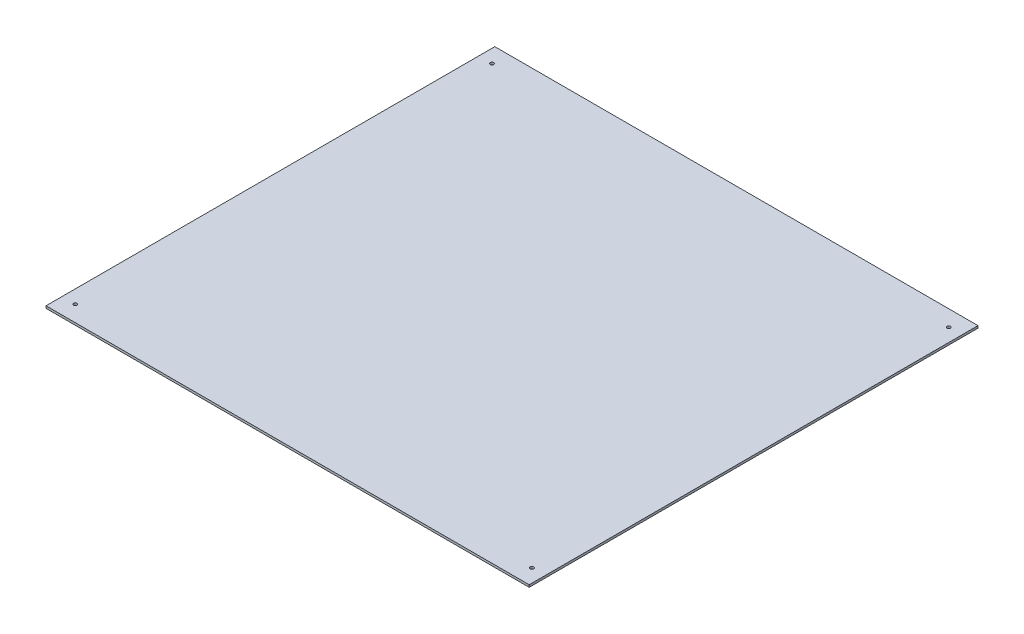
ISO-10303-21;
HEADER;
FILE_DESCRIPTION(('STEP AP214'),'2;1');
FILE_NAME('part.step','',(''),(''),'','','');
FILE_SCHEMA(('AUTOMOTIVE_DESIGN { 1 0 10303 214 1 1 1 1 }'));
ENDSEC;
DATA;
#1=APPLICATION_CONTEXT('core data for automotive mechanical design processes');
#2=APPLICATION_PROTOCOL_DEFINITION('international standard','automotive_design',2000,#1);
#3=PRODUCT_CONTEXT('',#1,'mechanical');
#4=PRODUCT('Part','Part','',(#3));
#5=PRODUCT_RELATED_PRODUCT_CATEGORY('part','',(#4));
#6=PRODUCT_DEFINITION_FORMATION('','',#4);
#7=PRODUCT_DEFINITION_CONTEXT('part definition',#1,'design');
#8=PRODUCT_DEFINITION('design','',#6,#7);
#9=PRODUCT_DEFINITION_SHAPE('','',#8);
#10=(LENGTH_UNIT() NAMED_UNIT(*) SI_UNIT(.MILLI.,.METRE.));
#11=(NAMED_UNIT(*) PLANE_ANGLE_UNIT() SI_UNIT($,.RADIAN.));
#12=(NAMED_UNIT(*) SI_UNIT($,.STERADIAN.) SOLID_ANGLE_UNIT());
#13=UNCERTAINTY_MEASURE_WITH_UNIT(LENGTH_MEASURE(1.E-05),#10,'distance_accuracy_value','');
#14=(GEOMETRIC_REPRESENTATION_CONTEXT(3) GLOBAL_UNCERTAINTY_ASSIGNED_CONTEXT((#13)) GLOBAL_UNIT_ASSIGNED_CONTEXT((#10,
#11,#12)) REPRESENTATION_CONTEXT('',''));
#15=CARTESIAN_POINT('',(0.,0.,0.));
#16=DIRECTION('',(0.,0.,1.));
#17=DIRECTION('',(1.,0.,0.));
#18=AXIS2_PLACEMENT_3D('',#15,#16,#17);
#19=CARTESIAN_POINT('',(0.,2.,0.));
#20=DIRECTION('',(0.,-1.,0.));
#21=DIRECTION('',(0.,0.,-1.));
#22=AXIS2_PLACEMENT_3D('',#19,#20,#21);
#23=PLANE('',#22);
#24=CARTESIAN_POINT('',(12.5,2.,-385.));
#25=DIRECTION('',(0.,1.,0.));
#26=DIRECTION('',(0.,0.,1.));
#27=AXIS2_PLACEMENT_3D('',#24,#25,#26);
#28=CIRCLE('',#27,1.55000000000003);
#29=CARTESIAN_POINT('',(12.5,2.,-383.45));
#30=VERTEX_POINT('',#29);
#31=EDGE_CURVE('E43',#30,#30,#28,.T.);
#32=ORIENTED_EDGE('',*,*,#31,.F.);
#33=EDGE_LOOP('',(#32));
#34=FACE_BOUND('',#33,.T.);
#35=CARTESIAN_POINT('',(418.,2.,-385.));
#36=DIRECTION('',(0.,1.,0.));
#37=DIRECTION('',(0.,0.,-1.));
#38=AXIS2_PLACEMENT_3D('',#35,#36,#37);
#39=CIRCLE('',#38,1.55);
#40=CARTESIAN_POINT('',(418.,2.,-386.55));
#41=VERTEX_POINT('',#40);
#42=EDGE_CURVE('E109',#41,#41,#39,.T.);
#43=ORIENTED_EDGE('',*,*,#42,.F.);
#44=EDGE_LOOP('',(#43));
#45=FACE_BOUND('',#44,.T.);
#46=CARTESIAN_POINT('',(418.,2.,-15.));
#47=DIRECTION('',(0.,1.,0.));
#48=DIRECTION('',(0.,0.,1.));
#49=AXIS2_PLACEMENT_3D('',#46,#47,#48);
#50=CIRCLE('',#49,1.54999999999999);
#51=CARTESIAN_POINT('',(418.,2.,-13.45));
#52=VERTEX_POINT('',#51);
#53=EDGE_CURVE('E116',#52,#52,#50,.T.);
#54=ORIENTED_EDGE('',*,*,#53,.F.);
#55=EDGE_LOOP('',(#54));
#56=FACE_BOUND('',#55,.T.);
#57=CARTESIAN_POINT('',(12.5,2.,-15.));
#58=DIRECTION('',(0.,1.,0.));
#59=DIRECTION('',(0.,0.,-1.));
#60=AXIS2_PLACEMENT_3D('',#57,#58,#59);
#61=CIRCLE('',#60,1.55000000000002);
#62=CARTESIAN_POINT('',(12.5,2.,-16.55));
#63=VERTEX_POINT('',#62);
#64=EDGE_CURVE('E101',#63,#63,#61,.T.);
#65=ORIENTED_EDGE('',*,*,#64,.F.);
#66=EDGE_LOOP('',(#65));
#67=FACE_BOUND('',#66,.T.);
#68=DIRECTION('',(0.,0.,-1.));
#69=VECTOR('',#68,1.);
#70=CARTESIAN_POINT('',(429.75,2.,-0.750000000000026));
#71=LINE('',#70,#69);
#72=CARTESIAN_POINT('',(429.75,2.,-0.750000000000026));
#73=VERTEX_POINT('',#72);
#74=CARTESIAN_POINT('',(429.75,2.,-399.25));
#75=VERTEX_POINT('',#74);
#76=EDGE_CURVE('E78',#73,#75,#71,.T.);
#77=ORIENTED_EDGE('',*,*,#76,.T.);
#78=DIRECTION('',(-1.,0.,0.));
#79=VECTOR('',#78,1.);
#80=CARTESIAN_POINT('',(429.75,2.,-399.25));
#81=LINE('',#80,#79);
#82=CARTESIAN_POINT('',(0.75,2.,-399.25));
#83=VERTEX_POINT('',#82);
#84=EDGE_CURVE('E90',#75,#83,#81,.T.);
#85=ORIENTED_EDGE('',*,*,#84,.T.);
#86=DIRECTION('',(0.,0.,1.));
#87=VECTOR('',#86,1.);
#88=CARTESIAN_POINT('',(0.75,2.,-399.25));
#89=LINE('',#88,#87);
#90=CARTESIAN_POINT('',(0.750000000000049,2.,-0.75));
#91=VERTEX_POINT('',#90);
#92=EDGE_CURVE('E50',#83,#91,#89,.T.);
#93=ORIENTED_EDGE('',*,*,#92,.T.);
#94=DIRECTION('',(1.,0.,0.));
#95=VECTOR('',#94,1.);
#96=CARTESIAN_POINT('',(0.750000000000049,2.,-0.75));
#97=LINE('',#96,#95);
#98=EDGE_CURVE('E104',#91,#73,#97,.T.);
#99=ORIENTED_EDGE('',*,*,#98,.T.);
#100=EDGE_LOOP('',(#77,#85,#93,#99));
#101=FACE_BOUND('',#100,.T.);
#102=ADVANCED_FACE('F35',(#34,#45,#56,#67,#101),#23,.F.);
#103=CARTESIAN_POINT('',(0.,0.,0.));
#104=DIRECTION('',(0.,-1.,0.));
#105=DIRECTION('',(0.,0.,-1.));
#106=AXIS2_PLACEMENT_3D('',#103,#104,#105);
#107=PLANE('',#106);
#108=CARTESIAN_POINT('',(12.5,0.,-385.));
#109=DIRECTION('',(0.,-1.,0.));
#110=DIRECTION('',(0.,0.,-1.));
#111=AXIS2_PLACEMENT_3D('',#108,#109,#110);
#112=CIRCLE('',#111,1.55000000000003);
#113=CARTESIAN_POINT('',(12.5,0.,-386.55));
#114=VERTEX_POINT('',#113);
#115=EDGE_CURVE('E11',#114,#114,#112,.F.);
#116=ORIENTED_EDGE('',*,*,#115,.T.);
#117=EDGE_LOOP('',(#116));
#118=FACE_BOUND('',#117,.T.);
#119=CARTESIAN_POINT('',(418.,0.,-385.));
#120=DIRECTION('',(0.,-1.,0.));
#121=DIRECTION('',(0.,0.,-1.));
#122=AXIS2_PLACEMENT_3D('',#119,#120,#121);
#123=CIRCLE('',#122,1.55);
#124=CARTESIAN_POINT('',(418.,0.,-386.55));
#125=VERTEX_POINT('',#124);
#126=EDGE_CURVE('E112',#125,#125,#123,.F.);
#127=ORIENTED_EDGE('',*,*,#126,.T.);
#128=EDGE_LOOP('',(#127));
#129=FACE_BOUND('',#128,.T.);
#130=CARTESIAN_POINT('',(418.,0.,-15.));
#131=DIRECTION('',(0.,-1.,0.));
#132=DIRECTION('',(0.,0.,-1.));
#133=AXIS2_PLACEMENT_3D('',#130,#131,#132);
#134=CIRCLE('',#133,1.54999999999999);
#135=CARTESIAN_POINT('',(418.,0.,-16.55));
#136=VERTEX_POINT('',#135);
#137=EDGE_CURVE('E113',#136,#136,#134,.F.);
#138=ORIENTED_EDGE('',*,*,#137,.T.);
#139=EDGE_LOOP('',(#138));
#140=FACE_BOUND('',#139,.T.);
#141=CARTESIAN_POINT('',(12.5,0.,-15.));
#142=DIRECTION('',(0.,-1.,0.));
#143=DIRECTION('',(0.,0.,-1.));
#144=AXIS2_PLACEMENT_3D('',#141,#142,#143);
#145=CIRCLE('',#144,1.55000000000002);
#146=CARTESIAN_POINT('',(12.5,0.,-16.55));
#147=VERTEX_POINT('',#146);
#148=EDGE_CURVE('E119',#147,#147,#145,.F.);
#149=ORIENTED_EDGE('',*,*,#148,.T.);
#150=EDGE_LOOP('',(#149));
#151=FACE_BOUND('',#150,.T.);
#152=DIRECTION('',(-1.,0.,0.));
#153=VECTOR('',#152,1.);
#154=CARTESIAN_POINT('',(429.75,0.,-399.25));
#155=LINE('',#154,#153);
#156=CARTESIAN_POINT('',(429.75,0.,-399.25));
#157=VERTEX_POINT('',#156);
#158=CARTESIAN_POINT('',(0.749999999999973,0.,-399.25));
#159=VERTEX_POINT('',#158);
#160=EDGE_CURVE('E94',#157,#159,#155,.T.);
#161=ORIENTED_EDGE('',*,*,#160,.F.);
#162=DIRECTION('',(0.,0.,-1.));
#163=VECTOR('',#162,1.);
#164=CARTESIAN_POINT('',(429.75,0.,-0.750000000000026));
#165=LINE('',#164,#163);
#166=CARTESIAN_POINT('',(429.75,0.,-0.750000000000026));
#167=VERTEX_POINT('',#166);
#168=EDGE_CURVE('E58',#167,#157,#165,.T.);
#169=ORIENTED_EDGE('',*,*,#168,.F.);
#170=DIRECTION('',(1.,0.,0.));
#171=VECTOR('',#170,1.);
#172=CARTESIAN_POINT('',(0.750000000000049,0.,-0.75));
#173=LINE('',#172,#171);
#174=CARTESIAN_POINT('',(0.750000000000049,0.,-0.75));
#175=VERTEX_POINT('',#174);
#176=EDGE_CURVE('E84',#175,#167,#173,.T.);
#177=ORIENTED_EDGE('',*,*,#176,.F.);
#178=DIRECTION('',(0.,0.,1.));
#179=VECTOR('',#178,1.);
#180=CARTESIAN_POINT('',(0.75,0.,-399.25));
#181=LINE('',#180,#179);
#182=EDGE_CURVE('E96',#159,#175,#181,.T.);
#183=ORIENTED_EDGE('',*,*,#182,.F.);
#184=EDGE_LOOP('',(#161,#169,#177,#183));
#185=FACE_BOUND('',#184,.T.);
#186=ADVANCED_FACE('F37',(#118,#129,#140,#151,#185),#107,.T.);
#187=CARTESIAN_POINT('',(12.5,-4.38406204335671,-385.));
#188=DIRECTION('',(0.,1.,0.));
#189=DIRECTION('',(0.,0.,1.));
#190=AXIS2_PLACEMENT_3D('',#187,#188,#189);
#191=CYLINDRICAL_SURFACE('',#190,1.55000000000003);
#192=ORIENTED_EDGE('',*,*,#31,.T.);
#193=EDGE_LOOP('',(#192));
#194=FACE_BOUND('',#193,.T.);
#195=ORIENTED_EDGE('',*,*,#115,.F.);
#196=EDGE_LOOP('',(#195));
#197=FACE_BOUND('',#196,.T.);
#198=ADVANCED_FACE('F128',(#194,#197),#191,.F.);
#199=CARTESIAN_POINT('',(418.,-4.38406204335671,-385.));
#200=DIRECTION('',(0.,1.,0.));
#201=DIRECTION('',(0.,0.,1.));
#202=AXIS2_PLACEMENT_3D('',#199,#200,#201);
#203=CYLINDRICAL_SURFACE('',#202,1.55);
#204=ORIENTED_EDGE('',*,*,#42,.T.);
#205=EDGE_LOOP('',(#204));
#206=FACE_BOUND('',#205,.T.);
#207=ORIENTED_EDGE('',*,*,#126,.F.);
#208=EDGE_LOOP('',(#207));
#209=FACE_BOUND('',#208,.T.);
#210=ADVANCED_FACE('F158',(#206,#209),#203,.F.);
#211=CARTESIAN_POINT('',(418.,-4.38406204335671,-15.));
#212=DIRECTION('',(0.,1.,0.));
#213=DIRECTION('',(0.,0.,1.));
#214=AXIS2_PLACEMENT_3D('',#211,#212,#213);
#215=CYLINDRICAL_SURFACE('',#214,1.54999999999999);
#216=ORIENTED_EDGE('',*,*,#53,.T.);
#217=EDGE_LOOP('',(#216));
#218=FACE_BOUND('',#217,.T.);
#219=ORIENTED_EDGE('',*,*,#137,.F.);
#220=EDGE_LOOP('',(#219));
#221=FACE_BOUND('',#220,.T.);
#222=ADVANCED_FACE('F161',(#218,#221),#215,.F.);
#223=CARTESIAN_POINT('',(12.5,-4.38406204335671,-15.));
#224=DIRECTION('',(0.,1.,0.));
#225=DIRECTION('',(0.,0.,1.));
#226=AXIS2_PLACEMENT_3D('',#223,#224,#225);
#227=CYLINDRICAL_SURFACE('',#226,1.55000000000002);
#228=ORIENTED_EDGE('',*,*,#64,.T.);
#229=EDGE_LOOP('',(#228));
#230=FACE_BOUND('',#229,.T.);
#231=ORIENTED_EDGE('',*,*,#148,.F.);
#232=EDGE_LOOP('',(#231));
#233=FACE_BOUND('',#232,.T.);
#234=ADVANCED_FACE('F157',(#230,#233),#227,.F.);
#235=CARTESIAN_POINT('',(429.75,-587.648066447938,-0.750000000000026));
#236=DIRECTION('',(1.,0.,0.));
#237=DIRECTION('',(0.,0.,-1.));
#238=AXIS2_PLACEMENT_3D('',#235,#236,#237);
#239=PLANE('',#238);
#240=ORIENTED_EDGE('',*,*,#168,.T.);
#241=DIRECTION('',(0.,1.,0.));
#242=VECTOR('',#241,1.);
#243=CARTESIAN_POINT('',(429.75,-587.648066447938,-399.25));
#244=LINE('',#243,#242);
#245=EDGE_CURVE('E107',#157,#75,#244,.T.);
#246=ORIENTED_EDGE('',*,*,#245,.T.);
#247=ORIENTED_EDGE('',*,*,#76,.F.);
#248=DIRECTION('',(0.,1.,0.));
#249=VECTOR('',#248,1.);
#250=CARTESIAN_POINT('',(429.75,-587.648066447938,-0.750000000000026));
#251=LINE('',#250,#249);
#252=EDGE_CURVE('E74',#167,#73,#251,.T.);
#253=ORIENTED_EDGE('',*,*,#252,.F.);
#254=EDGE_LOOP('',(#240,#246,#247,#253));
#255=FACE_BOUND('',#254,.T.);
#256=ADVANCED_FACE('F76',(#255),#239,.T.);
#257=CARTESIAN_POINT('',(0.750000000000049,-587.648066447938,-0.75));
#258=DIRECTION('',(0.,0.,1.));
#259=DIRECTION('',(1.,0.,0.));
#260=AXIS2_PLACEMENT_3D('',#257,#258,#259);
#261=PLANE('',#260);
#262=ORIENTED_EDGE('',*,*,#176,.T.);
#263=ORIENTED_EDGE('',*,*,#252,.T.);
#264=ORIENTED_EDGE('',*,*,#98,.F.);
#265=DIRECTION('',(0.,1.,0.));
#266=VECTOR('',#265,1.);
#267=CARTESIAN_POINT('',(0.750000000000049,-587.648066447938,-0.75));
#268=LINE('',#267,#266);
#269=EDGE_CURVE('E86',#175,#91,#268,.T.);
#270=ORIENTED_EDGE('',*,*,#269,.F.);
#271=EDGE_LOOP('',(#262,#263,#264,#270));
#272=FACE_BOUND('',#271,.T.);
#273=ADVANCED_FACE('F85',(#272),#261,.T.);
#274=CARTESIAN_POINT('',(0.75,-587.648066447938,-399.25));
#275=DIRECTION('',(-1.,0.,0.));
#276=DIRECTION('',(0.,0.,1.));
#277=AXIS2_PLACEMENT_3D('',#274,#275,#276);
#278=PLANE('',#277);
#279=ORIENTED_EDGE('',*,*,#182,.T.);
#280=ORIENTED_EDGE('',*,*,#269,.T.);
#281=ORIENTED_EDGE('',*,*,#92,.F.);
#282=DIRECTION('',(0.,1.,0.));
#283=VECTOR('',#282,1.);
#284=CARTESIAN_POINT('',(0.75,-587.648066447938,-399.25));
#285=LINE('',#284,#283);
#286=EDGE_CURVE('E105',#159,#83,#285,.T.);
#287=ORIENTED_EDGE('',*,*,#286,.F.);
#288=EDGE_LOOP('',(#279,#280,#281,#287));
#289=FACE_BOUND('',#288,.T.);
#290=ADVANCED_FACE('F145',(#289),#278,.T.);
#291=CARTESIAN_POINT('',(429.75,-587.648066447938,-399.25));
#292=DIRECTION('',(0.,0.,-1.));
#293=DIRECTION('',(-1.,0.,0.));
#294=AXIS2_PLACEMENT_3D('',#291,#292,#293);
#295=PLANE('',#294);
#296=ORIENTED_EDGE('',*,*,#160,.T.);
#297=ORIENTED_EDGE('',*,*,#286,.T.);
#298=ORIENTED_EDGE('',*,*,#84,.F.);
#299=ORIENTED_EDGE('',*,*,#245,.F.);
#300=EDGE_LOOP('',(#296,#297,#298,#299));
#301=FACE_BOUND('',#300,.T.);
#302=ADVANCED_FACE('F144',(#301),#295,.T.);
#303=CLOSED_SHELL('',(#102,#186,#198,#210,#222,#234,#256,#273,#290,#302));
#304=MANIFOLD_SOLID_BREP('B2',#303);
#305=ADVANCED_BREP_SHAPE_REPRESENTATION('',(#18,#304),#14);
#306=SHAPE_DEFINITION_REPRESENTATION(#9,#305);
ENDSEC;
END-ISO-10303-21;
